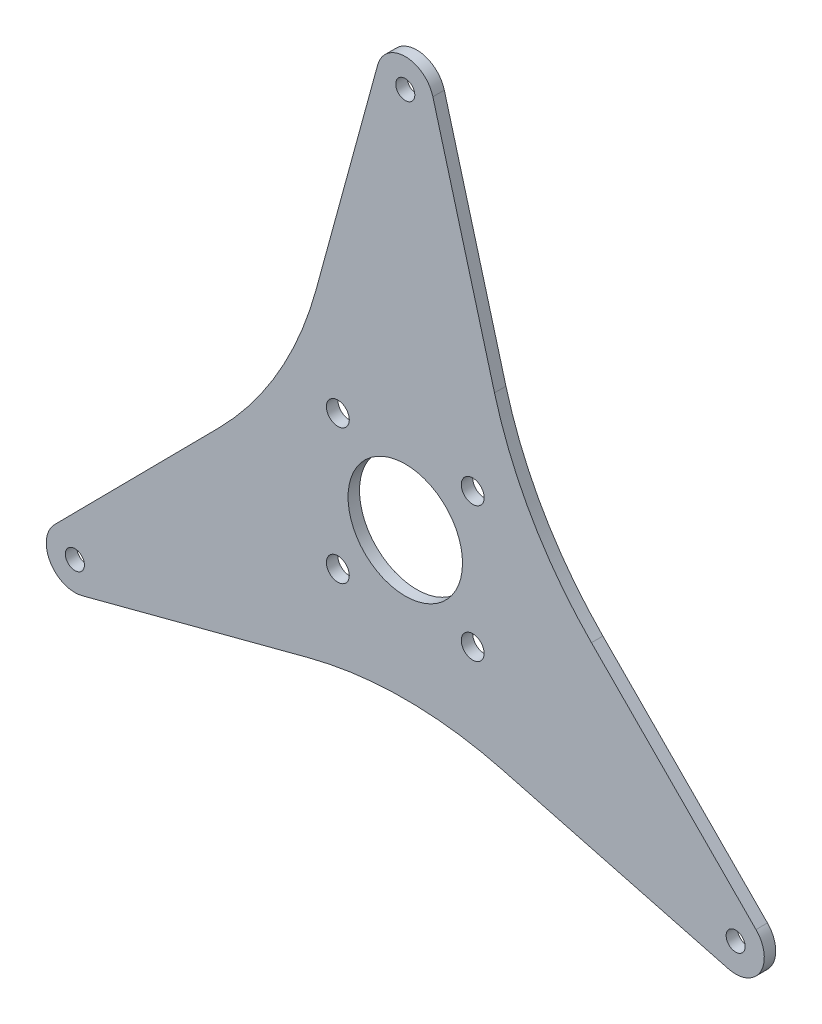
ISO-10303-21;
HEADER;
FILE_DESCRIPTION(('STEP AP214'),'2;1');
FILE_NAME('part.step','',(''),(''),'','','');
FILE_SCHEMA(('AUTOMOTIVE_DESIGN { 1 0 10303 214 1 1 1 1 }'));
ENDSEC;
DATA;
#1=APPLICATION_CONTEXT('core data for automotive mechanical design processes');
#2=APPLICATION_PROTOCOL_DEFINITION('international standard','automotive_design',2000,#1);
#3=PRODUCT_CONTEXT('',#1,'mechanical');
#4=PRODUCT('Part','Part','',(#3));
#5=PRODUCT_RELATED_PRODUCT_CATEGORY('part','',(#4));
#6=PRODUCT_DEFINITION_FORMATION('','',#4);
#7=PRODUCT_DEFINITION_CONTEXT('part definition',#1,'design');
#8=PRODUCT_DEFINITION('design','',#6,#7);
#9=PRODUCT_DEFINITION_SHAPE('','',#8);
#10=(LENGTH_UNIT() NAMED_UNIT(*) SI_UNIT(.MILLI.,.METRE.));
#11=(NAMED_UNIT(*) PLANE_ANGLE_UNIT() SI_UNIT($,.RADIAN.));
#12=(NAMED_UNIT(*) SI_UNIT($,.STERADIAN.) SOLID_ANGLE_UNIT());
#13=UNCERTAINTY_MEASURE_WITH_UNIT(LENGTH_MEASURE(1.E-05),#10,'distance_accuracy_value','');
#14=(GEOMETRIC_REPRESENTATION_CONTEXT(3) GLOBAL_UNCERTAINTY_ASSIGNED_CONTEXT((#13)) GLOBAL_UNIT_ASSIGNED_CONTEXT((#10,
#11,#12)) REPRESENTATION_CONTEXT('',''));
#15=CARTESIAN_POINT('',(0.,0.,0.));
#16=DIRECTION('',(0.,0.,1.));
#17=DIRECTION('',(1.,0.,0.));
#18=AXIS2_PLACEMENT_3D('',#15,#16,#17);
#19=CARTESIAN_POINT('',(-173.205080756888,-100.,6.));
#20=DIRECTION('',(0.,0.,1.));
#21=DIRECTION('',(1.,0.,0.));
#22=AXIS2_PLACEMENT_3D('',#19,#20,#21);
#23=PLANE('',#22);
#24=CARTESIAN_POINT('',(35.3553390593269,-35.3553390593278,6.));
#25=DIRECTION('',(0.,0.,1.));
#26=DIRECTION('',(1.,0.,0.));
#27=AXIS2_PLACEMENT_3D('',#24,#25,#26);
#28=CIRCLE('',#27,6.);
#29=CARTESIAN_POINT('',(41.3553390593269,-35.3553390593278,6.));
#30=VERTEX_POINT('',#29);
#31=EDGE_CURVE('E309',#30,#30,#28,.T.);
#32=ORIENTED_EDGE('',*,*,#31,.F.);
#33=EDGE_LOOP('',(#32));
#34=FACE_BOUND('',#33,.T.);
#35=CARTESIAN_POINT('',(-173.205080756888,-100.,6.));
#36=DIRECTION('',(0.,0.,1.));
#37=DIRECTION('',(1.,0.,0.));
#38=AXIS2_PLACEMENT_3D('',#35,#36,#37);
#39=CIRCLE('',#38,5.00000000000002);
#40=CARTESIAN_POINT('',(-168.205080756888,-100.,6.));
#41=VERTEX_POINT('',#40);
#42=EDGE_CURVE('E321',#41,#41,#39,.T.);
#43=ORIENTED_EDGE('',*,*,#42,.F.);
#44=EDGE_LOOP('',(#43));
#45=FACE_BOUND('',#44,.T.);
#46=CARTESIAN_POINT('',(0.,0.,6.));
#47=DIRECTION('',(0.,0.,1.));
#48=DIRECTION('',(1.,0.,0.));
#49=AXIS2_PLACEMENT_3D('',#46,#47,#48);
#50=CIRCLE('',#49,30.);
#51=CARTESIAN_POINT('',(30.,0.,6.));
#52=VERTEX_POINT('',#51);
#53=EDGE_CURVE('E333',#52,#52,#50,.T.);
#54=ORIENTED_EDGE('',*,*,#53,.F.);
#55=EDGE_LOOP('',(#54));
#56=FACE_BOUND('',#55,.T.);
#57=CARTESIAN_POINT('',(0.,200.,6.));
#58=DIRECTION('',(0.,0.,1.));
#59=DIRECTION('',(1.,0.,0.));
#60=AXIS2_PLACEMENT_3D('',#57,#58,#59);
#61=CIRCLE('',#60,5.00000000000001);
#62=CARTESIAN_POINT('',(5.0000000000001,200.,6.));
#63=VERTEX_POINT('',#62);
#64=EDGE_CURVE('E160',#63,#63,#61,.T.);
#65=ORIENTED_EDGE('',*,*,#64,.F.);
#66=EDGE_LOOP('',(#65));
#67=FACE_BOUND('',#66,.T.);
#68=CARTESIAN_POINT('',(-173.205080756888,-100.,6.));
#69=DIRECTION('',(0.,0.,1.));
#70=DIRECTION('',(1.,0.,0.));
#71=AXIS2_PLACEMENT_3D('',#68,#69,#70);
#72=CIRCLE('',#71,15.);
#73=CARTESIAN_POINT('',(-183.863104209123,-89.4450705311879,6.));
#74=VERTEX_POINT('',#73);
#75=CARTESIAN_POINT('',(-169.393255427861,-114.507583798172,6.));
#76=VERTEX_POINT('',#75);
#77=EDGE_CURVE('E179',#74,#76,#72,.T.);
#78=ORIENTED_EDGE('',*,*,#77,.T.);
#79=DIRECTION('',(0.967172253211489,0.254121688601761,0.));
#80=VECTOR('',#79,1.);
#81=CARTESIAN_POINT('',(-169.393255427861,-114.507583798172,6.));
#82=LINE('',#81,#80);
#83=CARTESIAN_POINT('',(-50.8243377203522,-83.3539464978198,6.));
#84=VERTEX_POINT('',#83);
#85=EDGE_CURVE('E107',#76,#84,#82,.T.);
#86=ORIENTED_EDGE('',*,*,#85,.T.);
#87=CARTESIAN_POINT('',(0.,-276.788397140118,6.));
#88=DIRECTION('',(0.,0.,-1.));
#89=DIRECTION('',(-1.,0.,0.));
#90=AXIS2_PLACEMENT_3D('',#87,#88,#89);
#91=CIRCLE('',#90,200.);
#92=CARTESIAN_POINT('',(50.8243377203522,-83.3539464978198,6.));
#93=VERTEX_POINT('',#92);
#94=EDGE_CURVE('E206',#84,#93,#91,.T.);
#95=ORIENTED_EDGE('',*,*,#94,.T.);
#96=DIRECTION('',(0.967172253211489,-0.254121688601761,0.));
#97=VECTOR('',#96,1.);
#98=CARTESIAN_POINT('',(50.8243377203522,-83.3539464978198,6.));
#99=LINE('',#98,#97);
#100=CARTESIAN_POINT('',(169.393255427861,-114.507583798172,6.));
#101=VERTEX_POINT('',#100);
#102=EDGE_CURVE('E225',#93,#101,#99,.T.);
#103=ORIENTED_EDGE('',*,*,#102,.T.);
#104=CARTESIAN_POINT('',(173.205080756888,-100.,6.));
#105=DIRECTION('',(0.,0.,1.));
#106=DIRECTION('',(1.,0.,0.));
#107=AXIS2_PLACEMENT_3D('',#104,#105,#106);
#108=CIRCLE('',#107,15.);
#109=CARTESIAN_POINT('',(183.863104209123,-89.4450705311879,6.));
#110=VERTEX_POINT('',#109);
#111=EDGE_CURVE('E222',#101,#110,#108,.T.);
#112=ORIENTED_EDGE('',*,*,#111,.T.);
#113=DIRECTION('',(-0.703661964587469,0.710534896815704,0.));
#114=VECTOR('',#113,1.);
#115=CARTESIAN_POINT('',(97.5988040329771,-2.33819434743504,6.));
#116=LINE('',#115,#114);
#117=CARTESIAN_POINT('',(97.5988040329771,-2.33819434743496,6.));
#118=VERTEX_POINT('',#117);
#119=EDGE_CURVE('E224',#110,#118,#116,.T.);
#120=ORIENTED_EDGE('',*,*,#119,.T.);
#121=CARTESIAN_POINT('',(239.705783396118,138.394198570059,6.));
#122=DIRECTION('',(0.,0.,-1.));
#123=DIRECTION('',(1.,0.,0.));
#124=AXIS2_PLACEMENT_3D('',#121,#122,#123);
#125=CIRCLE('',#124,200.);
#126=CARTESIAN_POINT('',(46.7744663126249,85.6921408452544,6.));
#127=VERTEX_POINT('',#126);
#128=EDGE_CURVE('E227',#118,#127,#125,.T.);
#129=ORIENTED_EDGE('',*,*,#128,.T.);
#130=DIRECTION('',(-0.263510288624021,0.964656585417466,0.));
#131=VECTOR('',#130,1.);
#132=CARTESIAN_POINT('',(14.4698487812621,203.95265432936,6.));
#133=LINE('',#132,#131);
#134=CARTESIAN_POINT('',(14.4698487812622,203.95265432936,6.));
#135=VERTEX_POINT('',#134);
#136=EDGE_CURVE('E233',#127,#135,#133,.T.);
#137=ORIENTED_EDGE('',*,*,#136,.T.);
#138=CARTESIAN_POINT('',(0.,200.,6.));
#139=DIRECTION('',(0.,0.,1.));
#140=DIRECTION('',(1.,0.,0.));
#141=AXIS2_PLACEMENT_3D('',#138,#139,#140);
#142=CIRCLE('',#141,15.0000000000001);
#143=CARTESIAN_POINT('',(-14.4698487812621,203.95265432936,6.));
#144=VERTEX_POINT('',#143);
#145=EDGE_CURVE('E138',#135,#144,#142,.T.);
#146=ORIENTED_EDGE('',*,*,#145,.T.);
#147=DIRECTION('',(-0.263510288624021,-0.964656585417466,0.));
#148=VECTOR('',#147,1.);
#149=CARTESIAN_POINT('',(-46.7744663126249,85.6921408452544,6.));
#150=LINE('',#149,#148);
#151=CARTESIAN_POINT('',(-46.7744663126249,85.6921408452544,6.));
#152=VERTEX_POINT('',#151);
#153=EDGE_CURVE('E132',#144,#152,#150,.T.);
#154=ORIENTED_EDGE('',*,*,#153,.T.);
#155=CARTESIAN_POINT('',(-239.705783396118,138.394198570059,6.));
#156=DIRECTION('',(0.,0.,-1.));
#157=DIRECTION('',(1.,0.,0.));
#158=AXIS2_PLACEMENT_3D('',#155,#156,#157);
#159=CIRCLE('',#158,200.);
#160=CARTESIAN_POINT('',(-97.5988040329771,-2.33819434743504,6.));
#161=VERTEX_POINT('',#160);
#162=EDGE_CURVE('E136',#152,#161,#159,.T.);
#163=ORIENTED_EDGE('',*,*,#162,.T.);
#164=DIRECTION('',(-0.703661964587469,-0.710534896815704,0.));
#165=VECTOR('',#164,1.);
#166=CARTESIAN_POINT('',(-183.863104209123,-89.4450705311879,6.));
#167=LINE('',#166,#165);
#168=EDGE_CURVE('E52',#161,#74,#167,.T.);
#169=ORIENTED_EDGE('',*,*,#168,.T.);
#170=EDGE_LOOP('',(#78,#86,#95,#103,#112,#120,#129,#137,#146,#154,#163,#169));
#171=FACE_BOUND('',#170,.T.);
#172=CARTESIAN_POINT('',(-35.3553390593272,35.3553390593276,6.));
#173=DIRECTION('',(0.,0.,1.));
#174=DIRECTION('',(1.,0.,0.));
#175=AXIS2_PLACEMENT_3D('',#172,#173,#174);
#176=CIRCLE('',#175,5.99999999999998);
#177=CARTESIAN_POINT('',(-29.3553390593272,35.3553390593276,6.));
#178=VERTEX_POINT('',#177);
#179=EDGE_CURVE('E339',#178,#178,#176,.T.);
#180=ORIENTED_EDGE('',*,*,#179,.F.);
#181=EDGE_LOOP('',(#180));
#182=FACE_BOUND('',#181,.T.);
#183=CARTESIAN_POINT('',(173.205080756888,-100.,6.));
#184=DIRECTION('',(0.,0.,1.));
#185=DIRECTION('',(1.,0.,0.));
#186=AXIS2_PLACEMENT_3D('',#183,#184,#185);
#187=CIRCLE('',#186,4.99999999999999);
#188=CARTESIAN_POINT('',(178.205080756888,-100.,6.));
#189=VERTEX_POINT('',#188);
#190=EDGE_CURVE('E327',#189,#189,#187,.T.);
#191=ORIENTED_EDGE('',*,*,#190,.F.);
#192=EDGE_LOOP('',(#191));
#193=FACE_BOUND('',#192,.T.);
#194=CARTESIAN_POINT('',(35.3553390593277,35.3553390593271,6.));
#195=DIRECTION('',(0.,0.,1.));
#196=DIRECTION('',(1.,0.,0.));
#197=AXIS2_PLACEMENT_3D('',#194,#195,#196);
#198=CIRCLE('',#197,6.);
#199=CARTESIAN_POINT('',(41.3553390593277,35.3553390593271,6.));
#200=VERTEX_POINT('',#199);
#201=EDGE_CURVE('E315',#200,#200,#198,.T.);
#202=ORIENTED_EDGE('',*,*,#201,.F.);
#203=EDGE_LOOP('',(#202));
#204=FACE_BOUND('',#203,.T.);
#205=CARTESIAN_POINT('',(-35.3553390593279,-35.3553390593268,6.));
#206=DIRECTION('',(0.,0.,1.));
#207=DIRECTION('',(1.,0.,0.));
#208=AXIS2_PLACEMENT_3D('',#205,#206,#207);
#209=CIRCLE('',#208,6.00000000000001);
#210=CARTESIAN_POINT('',(-29.3553390593279,-35.3553390593268,6.));
#211=VERTEX_POINT('',#210);
#212=EDGE_CURVE('E300',#211,#211,#209,.T.);
#213=ORIENTED_EDGE('',*,*,#212,.F.);
#214=EDGE_LOOP('',(#213));
#215=FACE_BOUND('',#214,.T.);
#216=ADVANCED_FACE('F35',(#34,#45,#56,#67,#171,#182,#193,#204,#215),#23,.T.);
#217=CARTESIAN_POINT('',(-173.205080756888,-100.,0.));
#218=DIRECTION('',(0.,0.,1.));
#219=DIRECTION('',(1.,0.,0.));
#220=AXIS2_PLACEMENT_3D('',#217,#218,#219);
#221=PLANE('',#220);
#222=CARTESIAN_POINT('',(-173.205080756888,-100.,0.));
#223=DIRECTION('',(0.,0.,1.));
#224=DIRECTION('',(1.,0.,0.));
#225=AXIS2_PLACEMENT_3D('',#222,#223,#224);
#226=CIRCLE('',#225,15.);
#227=CARTESIAN_POINT('',(-183.863104209123,-89.4450705311879,0.));
#228=VERTEX_POINT('',#227);
#229=CARTESIAN_POINT('',(-169.393255427861,-114.507583798172,0.));
#230=VERTEX_POINT('',#229);
#231=EDGE_CURVE('E156',#228,#230,#226,.T.);
#232=ORIENTED_EDGE('',*,*,#231,.F.);
#233=DIRECTION('',(-0.703661964587469,-0.710534896815704,0.));
#234=VECTOR('',#233,1.);
#235=CARTESIAN_POINT('',(-183.863104209123,-89.4450705311879,0.));
#236=LINE('',#235,#234);
#237=CARTESIAN_POINT('',(-97.5988040329771,-2.33819434743504,0.));
#238=VERTEX_POINT('',#237);
#239=EDGE_CURVE('E99',#238,#228,#236,.T.);
#240=ORIENTED_EDGE('',*,*,#239,.F.);
#241=CARTESIAN_POINT('',(-239.705783396118,138.394198570059,0.));
#242=DIRECTION('',(0.,0.,-1.));
#243=DIRECTION('',(1.,0.,0.));
#244=AXIS2_PLACEMENT_3D('',#241,#242,#243);
#245=CIRCLE('',#244,200.);
#246=CARTESIAN_POINT('',(-46.7744663126249,85.6921408452544,0.));
#247=VERTEX_POINT('',#246);
#248=EDGE_CURVE('E93',#247,#238,#245,.T.);
#249=ORIENTED_EDGE('',*,*,#248,.F.);
#250=DIRECTION('',(-0.263510288624021,-0.964656585417466,0.));
#251=VECTOR('',#250,1.);
#252=CARTESIAN_POINT('',(-46.7744663126249,85.6921408452544,0.));
#253=LINE('',#252,#251);
#254=CARTESIAN_POINT('',(-14.4698487812621,203.95265432936,0.));
#255=VERTEX_POINT('',#254);
#256=EDGE_CURVE('E146',#255,#247,#253,.T.);
#257=ORIENTED_EDGE('',*,*,#256,.F.);
#258=CARTESIAN_POINT('',(0.,200.,0.));
#259=DIRECTION('',(0.,0.,1.));
#260=DIRECTION('',(1.,0.,0.));
#261=AXIS2_PLACEMENT_3D('',#258,#259,#260);
#262=CIRCLE('',#261,15.0000000000001);
#263=CARTESIAN_POINT('',(14.4698487812622,203.95265432936,0.));
#264=VERTEX_POINT('',#263);
#265=EDGE_CURVE('E174',#264,#255,#262,.T.);
#266=ORIENTED_EDGE('',*,*,#265,.F.);
#267=DIRECTION('',(-0.263510288624021,0.964656585417466,0.));
#268=VECTOR('',#267,1.);
#269=CARTESIAN_POINT('',(14.4698487812621,203.95265432936,0.));
#270=LINE('',#269,#268);
#271=CARTESIAN_POINT('',(46.7744663126249,85.6921408452544,0.));
#272=VERTEX_POINT('',#271);
#273=EDGE_CURVE('E172',#272,#264,#270,.T.);
#274=ORIENTED_EDGE('',*,*,#273,.F.);
#275=CARTESIAN_POINT('',(239.705783396118,138.394198570059,0.));
#276=DIRECTION('',(0.,0.,-1.));
#277=DIRECTION('',(1.,0.,0.));
#278=AXIS2_PLACEMENT_3D('',#275,#276,#277);
#279=CIRCLE('',#278,200.);
#280=CARTESIAN_POINT('',(97.5988040329771,-2.33819434743496,0.));
#281=VERTEX_POINT('',#280);
#282=EDGE_CURVE('E170',#281,#272,#279,.T.);
#283=ORIENTED_EDGE('',*,*,#282,.F.);
#284=DIRECTION('',(-0.703661964587469,0.710534896815704,0.));
#285=VECTOR('',#284,1.);
#286=CARTESIAN_POINT('',(97.5988040329771,-2.33819434743504,0.));
#287=LINE('',#286,#285);
#288=CARTESIAN_POINT('',(183.863104209123,-89.4450705311879,0.));
#289=VERTEX_POINT('',#288);
#290=EDGE_CURVE('E168',#289,#281,#287,.T.);
#291=ORIENTED_EDGE('',*,*,#290,.F.);
#292=CARTESIAN_POINT('',(173.205080756888,-100.,0.));
#293=DIRECTION('',(0.,0.,1.));
#294=DIRECTION('',(1.,0.,0.));
#295=AXIS2_PLACEMENT_3D('',#292,#293,#294);
#296=CIRCLE('',#295,15.);
#297=CARTESIAN_POINT('',(169.393255427861,-114.507583798172,0.));
#298=VERTEX_POINT('',#297);
#299=EDGE_CURVE('E166',#298,#289,#296,.T.);
#300=ORIENTED_EDGE('',*,*,#299,.F.);
#301=DIRECTION('',(0.967172253211489,-0.254121688601761,0.));
#302=VECTOR('',#301,1.);
#303=CARTESIAN_POINT('',(50.8243377203522,-83.3539464978198,0.));
#304=LINE('',#303,#302);
#305=CARTESIAN_POINT('',(50.8243377203522,-83.3539464978198,0.));
#306=VERTEX_POINT('',#305);
#307=EDGE_CURVE('E164',#306,#298,#304,.T.);
#308=ORIENTED_EDGE('',*,*,#307,.F.);
#309=CARTESIAN_POINT('',(0.,-276.788397140118,0.));
#310=DIRECTION('',(0.,0.,-1.));
#311=DIRECTION('',(-1.,0.,0.));
#312=AXIS2_PLACEMENT_3D('',#309,#310,#311);
#313=CIRCLE('',#312,200.);
#314=CARTESIAN_POINT('',(-50.8243377203522,-83.3539464978198,0.));
#315=VERTEX_POINT('',#314);
#316=EDGE_CURVE('E162',#315,#306,#313,.T.);
#317=ORIENTED_EDGE('',*,*,#316,.F.);
#318=DIRECTION('',(0.967172253211489,0.254121688601761,0.));
#319=VECTOR('',#318,1.);
#320=CARTESIAN_POINT('',(-169.393255427861,-114.507583798172,0.));
#321=LINE('',#320,#319);
#322=EDGE_CURVE('E159',#230,#315,#321,.T.);
#323=ORIENTED_EDGE('',*,*,#322,.F.);
#324=EDGE_LOOP('',(#232,#240,#249,#257,#266,#274,#283,#291,#300,#308,#317,#323));
#325=FACE_BOUND('',#324,.T.);
#326=CARTESIAN_POINT('',(0.,200.,0.));
#327=DIRECTION('',(0.,0.,1.));
#328=DIRECTION('',(1.,0.,0.));
#329=AXIS2_PLACEMENT_3D('',#326,#327,#328);
#330=CIRCLE('',#329,5.00000000000001);
#331=CARTESIAN_POINT('',(5.0000000000001,200.,0.));
#332=VERTEX_POINT('',#331);
#333=EDGE_CURVE('E342',#332,#332,#330,.T.);
#334=ORIENTED_EDGE('',*,*,#333,.T.);
#335=EDGE_LOOP('',(#334));
#336=FACE_BOUND('',#335,.T.);
#337=CARTESIAN_POINT('',(-35.3553390593272,35.3553390593276,0.));
#338=DIRECTION('',(0.,0.,1.));
#339=DIRECTION('',(1.,0.,0.));
#340=AXIS2_PLACEMENT_3D('',#337,#338,#339);
#341=CIRCLE('',#340,5.99999999999998);
#342=CARTESIAN_POINT('',(-29.3553390593272,35.3553390593276,0.));
#343=VERTEX_POINT('',#342);
#344=EDGE_CURVE('E336',#343,#343,#341,.T.);
#345=ORIENTED_EDGE('',*,*,#344,.T.);
#346=EDGE_LOOP('',(#345));
#347=FACE_BOUND('',#346,.T.);
#348=CARTESIAN_POINT('',(0.,0.,0.));
#349=DIRECTION('',(0.,0.,1.));
#350=DIRECTION('',(1.,0.,0.));
#351=AXIS2_PLACEMENT_3D('',#348,#349,#350);
#352=CIRCLE('',#351,30.);
#353=CARTESIAN_POINT('',(30.,0.,0.));
#354=VERTEX_POINT('',#353);
#355=EDGE_CURVE('E330',#354,#354,#352,.T.);
#356=ORIENTED_EDGE('',*,*,#355,.T.);
#357=EDGE_LOOP('',(#356));
#358=FACE_BOUND('',#357,.T.);
#359=CARTESIAN_POINT('',(173.205080756888,-100.,0.));
#360=DIRECTION('',(0.,0.,1.));
#361=DIRECTION('',(1.,0.,0.));
#362=AXIS2_PLACEMENT_3D('',#359,#360,#361);
#363=CIRCLE('',#362,4.99999999999999);
#364=CARTESIAN_POINT('',(178.205080756888,-100.,0.));
#365=VERTEX_POINT('',#364);
#366=EDGE_CURVE('E324',#365,#365,#363,.T.);
#367=ORIENTED_EDGE('',*,*,#366,.T.);
#368=EDGE_LOOP('',(#367));
#369=FACE_BOUND('',#368,.T.);
#370=CARTESIAN_POINT('',(-173.205080756888,-100.,0.));
#371=DIRECTION('',(0.,0.,1.));
#372=DIRECTION('',(1.,0.,0.));
#373=AXIS2_PLACEMENT_3D('',#370,#371,#372);
#374=CIRCLE('',#373,5.00000000000002);
#375=CARTESIAN_POINT('',(-168.205080756888,-100.,0.));
#376=VERTEX_POINT('',#375);
#377=EDGE_CURVE('E318',#376,#376,#374,.T.);
#378=ORIENTED_EDGE('',*,*,#377,.T.);
#379=EDGE_LOOP('',(#378));
#380=FACE_BOUND('',#379,.T.);
#381=CARTESIAN_POINT('',(35.3553390593277,35.3553390593271,0.));
#382=DIRECTION('',(0.,0.,1.));
#383=DIRECTION('',(1.,0.,0.));
#384=AXIS2_PLACEMENT_3D('',#381,#382,#383);
#385=CIRCLE('',#384,6.);
#386=CARTESIAN_POINT('',(41.3553390593277,35.3553390593271,0.));
#387=VERTEX_POINT('',#386);
#388=EDGE_CURVE('E312',#387,#387,#385,.T.);
#389=ORIENTED_EDGE('',*,*,#388,.T.);
#390=EDGE_LOOP('',(#389));
#391=FACE_BOUND('',#390,.T.);
#392=CARTESIAN_POINT('',(35.3553390593269,-35.3553390593278,0.));
#393=DIRECTION('',(0.,0.,1.));
#394=DIRECTION('',(1.,0.,0.));
#395=AXIS2_PLACEMENT_3D('',#392,#393,#394);
#396=CIRCLE('',#395,6.);
#397=CARTESIAN_POINT('',(41.3553390593269,-35.3553390593278,0.));
#398=VERTEX_POINT('',#397);
#399=EDGE_CURVE('E306',#398,#398,#396,.T.);
#400=ORIENTED_EDGE('',*,*,#399,.T.);
#401=EDGE_LOOP('',(#400));
#402=FACE_BOUND('',#401,.T.);
#403=CARTESIAN_POINT('',(-35.3553390593279,-35.3553390593268,0.));
#404=DIRECTION('',(0.,0.,1.));
#405=DIRECTION('',(1.,0.,0.));
#406=AXIS2_PLACEMENT_3D('',#403,#404,#405);
#407=CIRCLE('',#406,6.00000000000001);
#408=CARTESIAN_POINT('',(-29.3553390593279,-35.3553390593268,0.));
#409=VERTEX_POINT('',#408);
#410=EDGE_CURVE('E303',#409,#409,#407,.T.);
#411=ORIENTED_EDGE('',*,*,#410,.T.);
#412=EDGE_LOOP('',(#411));
#413=FACE_BOUND('',#412,.T.);
#414=ADVANCED_FACE('F210',(#325,#336,#347,#358,#369,#380,#391,#402,#413),#221,.F.);
#415=CARTESIAN_POINT('',(-173.205080756888,-100.,6.));
#416=DIRECTION('',(0.,0.,-1.));
#417=DIRECTION('',(-1.,0.,0.));
#418=AXIS2_PLACEMENT_3D('',#415,#416,#417);
#419=CYLINDRICAL_SURFACE('',#418,15.);
#420=ORIENTED_EDGE('',*,*,#231,.T.);
#421=DIRECTION('',(0.,0.,-1.));
#422=VECTOR('',#421,1.);
#423=CARTESIAN_POINT('',(-169.393255427861,-114.507583798172,6.));
#424=LINE('',#423,#422);
#425=EDGE_CURVE('E11',#76,#230,#424,.T.);
#426=ORIENTED_EDGE('',*,*,#425,.F.);
#427=ORIENTED_EDGE('',*,*,#77,.F.);
#428=DIRECTION('',(0.,0.,-1.));
#429=VECTOR('',#428,1.);
#430=CARTESIAN_POINT('',(-183.863104209123,-89.4450705311879,6.));
#431=LINE('',#430,#429);
#432=EDGE_CURVE('E152',#74,#228,#431,.T.);
#433=ORIENTED_EDGE('',*,*,#432,.T.);
#434=EDGE_LOOP('',(#420,#426,#427,#433));
#435=FACE_BOUND('',#434,.T.);
#436=ADVANCED_FACE('F37',(#435),#419,.T.);
#437=CARTESIAN_POINT('',(-169.393255427861,-114.507583798172,6.));
#438=DIRECTION('',(-0.254121688601761,0.967172253211489,0.));
#439=DIRECTION('',(-0.967172253211489,-0.254121688601761,0.));
#440=AXIS2_PLACEMENT_3D('',#437,#438,#439);
#441=PLANE('',#440);
#442=ORIENTED_EDGE('',*,*,#322,.T.);
#443=DIRECTION('',(0.,0.,-1.));
#444=VECTOR('',#443,1.);
#445=CARTESIAN_POINT('',(-50.8243377203522,-83.3539464978198,6.));
#446=LINE('',#445,#444);
#447=EDGE_CURVE('E44',#84,#315,#446,.T.);
#448=ORIENTED_EDGE('',*,*,#447,.F.);
#449=ORIENTED_EDGE('',*,*,#85,.F.);
#450=ORIENTED_EDGE('',*,*,#425,.T.);
#451=EDGE_LOOP('',(#442,#448,#449,#450));
#452=FACE_BOUND('',#451,.T.);
#453=ADVANCED_FACE('F488',(#452),#441,.F.);
#454=CARTESIAN_POINT('',(0.,-276.788397140118,6.));
#455=DIRECTION('',(0.,0.,-1.));
#456=DIRECTION('',(-1.,0.,0.));
#457=AXIS2_PLACEMENT_3D('',#454,#455,#456);
#458=CYLINDRICAL_SURFACE('',#457,200.);
#459=ORIENTED_EDGE('',*,*,#316,.T.);
#460=DIRECTION('',(0.,0.,-1.));
#461=VECTOR('',#460,1.);
#462=CARTESIAN_POINT('',(50.8243377203522,-83.3539464978198,6.));
#463=LINE('',#462,#461);
#464=EDGE_CURVE('E198',#93,#306,#463,.T.);
#465=ORIENTED_EDGE('',*,*,#464,.F.);
#466=ORIENTED_EDGE('',*,*,#94,.F.);
#467=ORIENTED_EDGE('',*,*,#447,.T.);
#468=EDGE_LOOP('',(#459,#465,#466,#467));
#469=FACE_BOUND('',#468,.T.);
#470=ADVANCED_FACE('F204',(#469),#458,.F.);
#471=CARTESIAN_POINT('',(50.8243377203522,-83.3539464978198,6.));
#472=DIRECTION('',(0.254121688601761,0.967172253211489,0.));
#473=DIRECTION('',(-0.967172253211489,0.254121688601761,0.));
#474=AXIS2_PLACEMENT_3D('',#471,#472,#473);
#475=PLANE('',#474);
#476=ORIENTED_EDGE('',*,*,#307,.T.);
#477=DIRECTION('',(0.,0.,-1.));
#478=VECTOR('',#477,1.);
#479=CARTESIAN_POINT('',(169.393255427861,-114.507583798172,6.));
#480=LINE('',#479,#478);
#481=EDGE_CURVE('E195',#101,#298,#480,.T.);
#482=ORIENTED_EDGE('',*,*,#481,.F.);
#483=ORIENTED_EDGE('',*,*,#102,.F.);
#484=ORIENTED_EDGE('',*,*,#464,.T.);
#485=EDGE_LOOP('',(#476,#482,#483,#484));
#486=FACE_BOUND('',#485,.T.);
#487=ADVANCED_FACE('F216',(#486),#475,.F.);
#488=CARTESIAN_POINT('',(173.205080756888,-100.,6.));
#489=DIRECTION('',(0.,0.,-1.));
#490=DIRECTION('',(-1.,0.,0.));
#491=AXIS2_PLACEMENT_3D('',#488,#489,#490);
#492=CYLINDRICAL_SURFACE('',#491,15.);
#493=ORIENTED_EDGE('',*,*,#299,.T.);
#494=DIRECTION('',(0.,0.,-1.));
#495=VECTOR('',#494,1.);
#496=CARTESIAN_POINT('',(183.863104209123,-89.4450705311879,6.));
#497=LINE('',#496,#495);
#498=EDGE_CURVE('E192',#110,#289,#497,.T.);
#499=ORIENTED_EDGE('',*,*,#498,.F.);
#500=ORIENTED_EDGE('',*,*,#111,.F.);
#501=ORIENTED_EDGE('',*,*,#481,.T.);
#502=EDGE_LOOP('',(#493,#499,#500,#501));
#503=FACE_BOUND('',#502,.T.);
#504=ADVANCED_FACE('F220',(#503),#492,.T.);
#505=CARTESIAN_POINT('',(97.5988040329771,-2.33819434743504,6.));
#506=DIRECTION('',(-0.710534896815704,-0.703661964587469,0.));
#507=DIRECTION('',(0.703661964587469,-0.710534896815704,0.));
#508=AXIS2_PLACEMENT_3D('',#505,#506,#507);
#509=PLANE('',#508);
#510=ORIENTED_EDGE('',*,*,#290,.T.);
#511=DIRECTION('',(0.,0.,-1.));
#512=VECTOR('',#511,1.);
#513=CARTESIAN_POINT('',(97.5988040329771,-2.33819434743496,6.));
#514=LINE('',#513,#512);
#515=EDGE_CURVE('E189',#118,#281,#514,.T.);
#516=ORIENTED_EDGE('',*,*,#515,.F.);
#517=ORIENTED_EDGE('',*,*,#119,.F.);
#518=ORIENTED_EDGE('',*,*,#498,.T.);
#519=EDGE_LOOP('',(#510,#516,#517,#518));
#520=FACE_BOUND('',#519,.T.);
#521=ADVANCED_FACE('F453',(#520),#509,.F.);
#522=CARTESIAN_POINT('',(239.705783396118,138.394198570059,6.));
#523=DIRECTION('',(0.,0.,-1.));
#524=DIRECTION('',(-1.,0.,0.));
#525=AXIS2_PLACEMENT_3D('',#522,#523,#524);
#526=CYLINDRICAL_SURFACE('',#525,200.);
#527=ORIENTED_EDGE('',*,*,#282,.T.);
#528=DIRECTION('',(0.,0.,-1.));
#529=VECTOR('',#528,1.);
#530=CARTESIAN_POINT('',(46.7744663126249,85.6921408452544,6.));
#531=LINE('',#530,#529);
#532=EDGE_CURVE('E186',#127,#272,#531,.T.);
#533=ORIENTED_EDGE('',*,*,#532,.F.);
#534=ORIENTED_EDGE('',*,*,#128,.F.);
#535=ORIENTED_EDGE('',*,*,#515,.T.);
#536=EDGE_LOOP('',(#527,#533,#534,#535));
#537=FACE_BOUND('',#536,.T.);
#538=ADVANCED_FACE('F444',(#537),#526,.F.);
#539=CARTESIAN_POINT('',(14.4698487812621,203.95265432936,6.));
#540=DIRECTION('',(-0.964656585417466,-0.263510288624021,0.));
#541=DIRECTION('',(0.263510288624021,-0.964656585417466,0.));
#542=AXIS2_PLACEMENT_3D('',#539,#540,#541);
#543=PLANE('',#542);
#544=ORIENTED_EDGE('',*,*,#273,.T.);
#545=DIRECTION('',(0.,0.,-1.));
#546=VECTOR('',#545,1.);
#547=CARTESIAN_POINT('',(14.4698487812622,203.95265432936,6.));
#548=LINE('',#547,#546);
#549=EDGE_CURVE('E183',#135,#264,#548,.T.);
#550=ORIENTED_EDGE('',*,*,#549,.F.);
#551=ORIENTED_EDGE('',*,*,#136,.F.);
#552=ORIENTED_EDGE('',*,*,#532,.T.);
#553=EDGE_LOOP('',(#544,#550,#551,#552));
#554=FACE_BOUND('',#553,.T.);
#555=ADVANCED_FACE('F239',(#554),#543,.F.);
#556=CARTESIAN_POINT('',(0.,200.,6.));
#557=DIRECTION('',(0.,0.,-1.));
#558=DIRECTION('',(-1.,0.,0.));
#559=AXIS2_PLACEMENT_3D('',#556,#557,#558);
#560=CYLINDRICAL_SURFACE('',#559,15.0000000000001);
#561=ORIENTED_EDGE('',*,*,#265,.T.);
#562=DIRECTION('',(0.,0.,-1.));
#563=VECTOR('',#562,1.);
#564=CARTESIAN_POINT('',(-14.4698487812621,203.95265432936,6.));
#565=LINE('',#564,#563);
#566=EDGE_CURVE('E147',#144,#255,#565,.T.);
#567=ORIENTED_EDGE('',*,*,#566,.F.);
#568=ORIENTED_EDGE('',*,*,#145,.F.);
#569=ORIENTED_EDGE('',*,*,#549,.T.);
#570=EDGE_LOOP('',(#561,#567,#568,#569));
#571=FACE_BOUND('',#570,.T.);
#572=ADVANCED_FACE('F243',(#571),#560,.T.);
#573=CARTESIAN_POINT('',(-46.7744663126249,85.6921408452544,6.));
#574=DIRECTION('',(0.964656585417466,-0.263510288624021,0.));
#575=DIRECTION('',(0.263510288624021,0.964656585417466,0.));
#576=AXIS2_PLACEMENT_3D('',#573,#574,#575);
#577=PLANE('',#576);
#578=ORIENTED_EDGE('',*,*,#256,.T.);
#579=DIRECTION('',(0.,0.,-1.));
#580=VECTOR('',#579,1.);
#581=CARTESIAN_POINT('',(-46.7744663126249,85.6921408452544,6.));
#582=LINE('',#581,#580);
#583=EDGE_CURVE('E143',#152,#247,#582,.T.);
#584=ORIENTED_EDGE('',*,*,#583,.F.);
#585=ORIENTED_EDGE('',*,*,#153,.F.);
#586=ORIENTED_EDGE('',*,*,#566,.T.);
#587=EDGE_LOOP('',(#578,#584,#585,#586));
#588=FACE_BOUND('',#587,.T.);
#589=ADVANCED_FACE('F144',(#588),#577,.F.);
#590=CARTESIAN_POINT('',(-239.705783396118,138.394198570059,6.));
#591=DIRECTION('',(0.,0.,-1.));
#592=DIRECTION('',(-1.,0.,0.));
#593=AXIS2_PLACEMENT_3D('',#590,#591,#592);
#594=CYLINDRICAL_SURFACE('',#593,200.);
#595=ORIENTED_EDGE('',*,*,#248,.T.);
#596=DIRECTION('',(0.,0.,-1.));
#597=VECTOR('',#596,1.);
#598=CARTESIAN_POINT('',(-97.5988040329771,-2.33819434743504,6.));
#599=LINE('',#598,#597);
#600=EDGE_CURVE('E148',#161,#238,#599,.T.);
#601=ORIENTED_EDGE('',*,*,#600,.F.);
#602=ORIENTED_EDGE('',*,*,#162,.F.);
#603=ORIENTED_EDGE('',*,*,#583,.T.);
#604=EDGE_LOOP('',(#595,#601,#602,#603));
#605=FACE_BOUND('',#604,.T.);
#606=ADVANCED_FACE('F150',(#605),#594,.F.);
#607=CARTESIAN_POINT('',(-183.863104209123,-89.4450705311879,6.));
#608=DIRECTION('',(0.710534896815704,-0.703661964587469,0.));
#609=DIRECTION('',(0.703661964587469,0.710534896815704,0.));
#610=AXIS2_PLACEMENT_3D('',#607,#608,#609);
#611=PLANE('',#610);
#612=ORIENTED_EDGE('',*,*,#239,.T.);
#613=ORIENTED_EDGE('',*,*,#432,.F.);
#614=ORIENTED_EDGE('',*,*,#168,.F.);
#615=ORIENTED_EDGE('',*,*,#600,.T.);
#616=EDGE_LOOP('',(#612,#613,#614,#615));
#617=FACE_BOUND('',#616,.T.);
#618=ADVANCED_FACE('F247',(#617),#611,.F.);
#619=CARTESIAN_POINT('',(0.,200.,6.));
#620=DIRECTION('',(0.,0.,-1.));
#621=DIRECTION('',(-1.,0.,0.));
#622=AXIS2_PLACEMENT_3D('',#619,#620,#621);
#623=CYLINDRICAL_SURFACE('',#622,5.00000000000001);
#624=ORIENTED_EDGE('',*,*,#64,.T.);
#625=EDGE_LOOP('',(#624));
#626=FACE_BOUND('',#625,.T.);
#627=ORIENTED_EDGE('',*,*,#333,.F.);
#628=EDGE_LOOP('',(#627));
#629=FACE_BOUND('',#628,.T.);
#630=ADVANCED_FACE('F249',(#626,#629),#623,.F.);
#631=CARTESIAN_POINT('',(-35.3553390593272,35.3553390593276,6.));
#632=DIRECTION('',(0.,0.,-1.));
#633=DIRECTION('',(-1.,0.,0.));
#634=AXIS2_PLACEMENT_3D('',#631,#632,#633);
#635=CYLINDRICAL_SURFACE('',#634,5.99999999999998);
#636=ORIENTED_EDGE('',*,*,#179,.T.);
#637=EDGE_LOOP('',(#636));
#638=FACE_BOUND('',#637,.T.);
#639=ORIENTED_EDGE('',*,*,#344,.F.);
#640=EDGE_LOOP('',(#639));
#641=FACE_BOUND('',#640,.T.);
#642=ADVANCED_FACE('F255',(#638,#641),#635,.F.);
#643=CARTESIAN_POINT('',(0.,0.,6.));
#644=DIRECTION('',(0.,0.,-1.));
#645=DIRECTION('',(-1.,0.,0.));
#646=AXIS2_PLACEMENT_3D('',#643,#644,#645);
#647=CYLINDRICAL_SURFACE('',#646,30.);
#648=ORIENTED_EDGE('',*,*,#53,.T.);
#649=EDGE_LOOP('',(#648));
#650=FACE_BOUND('',#649,.T.);
#651=ORIENTED_EDGE('',*,*,#355,.F.);
#652=EDGE_LOOP('',(#651));
#653=FACE_BOUND('',#652,.T.);
#654=ADVANCED_FACE('F271',(#650,#653),#647,.F.);
#655=CARTESIAN_POINT('',(173.205080756888,-100.,6.));
#656=DIRECTION('',(0.,0.,-1.));
#657=DIRECTION('',(-1.,0.,0.));
#658=AXIS2_PLACEMENT_3D('',#655,#656,#657);
#659=CYLINDRICAL_SURFACE('',#658,4.99999999999999);
#660=ORIENTED_EDGE('',*,*,#190,.T.);
#661=EDGE_LOOP('',(#660));
#662=FACE_BOUND('',#661,.T.);
#663=ORIENTED_EDGE('',*,*,#366,.F.);
#664=EDGE_LOOP('',(#663));
#665=FACE_BOUND('',#664,.T.);
#666=ADVANCED_FACE('F275',(#662,#665),#659,.F.);
#667=CARTESIAN_POINT('',(-173.205080756888,-100.,6.));
#668=DIRECTION('',(0.,0.,-1.));
#669=DIRECTION('',(-1.,0.,0.));
#670=AXIS2_PLACEMENT_3D('',#667,#668,#669);
#671=CYLINDRICAL_SURFACE('',#670,5.00000000000002);
#672=ORIENTED_EDGE('',*,*,#42,.T.);
#673=EDGE_LOOP('',(#672));
#674=FACE_BOUND('',#673,.T.);
#675=ORIENTED_EDGE('',*,*,#377,.F.);
#676=EDGE_LOOP('',(#675));
#677=FACE_BOUND('',#676,.T.);
#678=ADVANCED_FACE('F279',(#674,#677),#671,.F.);
#679=CARTESIAN_POINT('',(35.3553390593277,35.3553390593271,6.));
#680=DIRECTION('',(0.,0.,-1.));
#681=DIRECTION('',(-1.,0.,0.));
#682=AXIS2_PLACEMENT_3D('',#679,#680,#681);
#683=CYLINDRICAL_SURFACE('',#682,6.);
#684=ORIENTED_EDGE('',*,*,#201,.T.);
#685=EDGE_LOOP('',(#684));
#686=FACE_BOUND('',#685,.T.);
#687=ORIENTED_EDGE('',*,*,#388,.F.);
#688=EDGE_LOOP('',(#687));
#689=FACE_BOUND('',#688,.T.);
#690=ADVANCED_FACE('F283',(#686,#689),#683,.F.);
#691=CARTESIAN_POINT('',(35.3553390593269,-35.3553390593278,6.));
#692=DIRECTION('',(0.,0.,-1.));
#693=DIRECTION('',(-1.,0.,0.));
#694=AXIS2_PLACEMENT_3D('',#691,#692,#693);
#695=CYLINDRICAL_SURFACE('',#694,6.);
#696=ORIENTED_EDGE('',*,*,#31,.T.);
#697=EDGE_LOOP('',(#696));
#698=FACE_BOUND('',#697,.T.);
#699=ORIENTED_EDGE('',*,*,#399,.F.);
#700=EDGE_LOOP('',(#699));
#701=FACE_BOUND('',#700,.T.);
#702=ADVANCED_FACE('F287',(#698,#701),#695,.F.);
#703=CARTESIAN_POINT('',(-35.3553390593279,-35.3553390593268,6.));
#704=DIRECTION('',(0.,0.,-1.));
#705=DIRECTION('',(-1.,0.,0.));
#706=AXIS2_PLACEMENT_3D('',#703,#704,#705);
#707=CYLINDRICAL_SURFACE('',#706,6.00000000000001);
#708=ORIENTED_EDGE('',*,*,#212,.T.);
#709=EDGE_LOOP('',(#708));
#710=FACE_BOUND('',#709,.T.);
#711=ORIENTED_EDGE('',*,*,#410,.F.);
#712=EDGE_LOOP('',(#711));
#713=FACE_BOUND('',#712,.T.);
#714=ADVANCED_FACE('F291',(#710,#713),#707,.F.);
#715=CLOSED_SHELL('',(#216,#414,#436,#453,#470,#487,#504,#521,#538,#555,#572,#589,#606,#618,
#630,#642,#654,#666,#678,#690,#702,#714));
#716=MANIFOLD_SOLID_BREP('B2',#715);
#717=ADVANCED_BREP_SHAPE_REPRESENTATION('',(#18,#716),#14);
#718=SHAPE_DEFINITION_REPRESENTATION(#9,#717);
ENDSEC;
END-ISO-10303-21;
